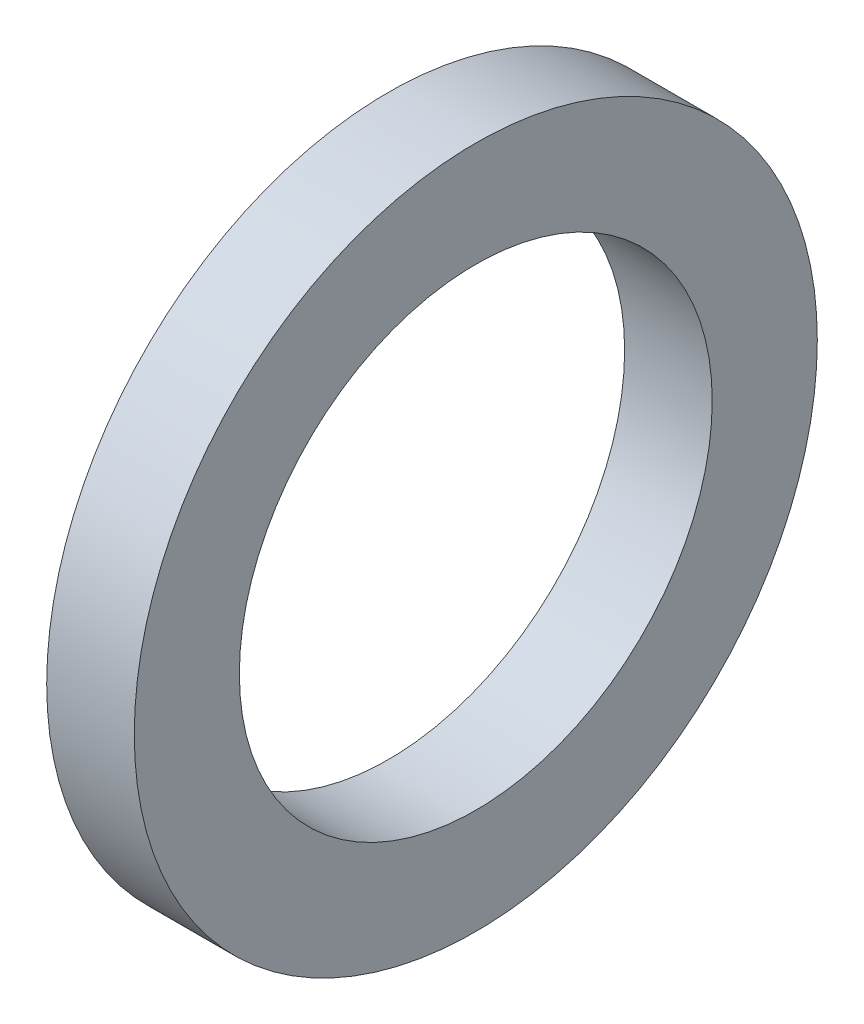
ISO-10303-21;
HEADER;
FILE_DESCRIPTION(('STEP AP214'),'2;1');
FILE_NAME('part.step','',(''),(''),'','','');
FILE_SCHEMA(('AUTOMOTIVE_DESIGN { 1 0 10303 214 1 1 1 1 }'));
ENDSEC;
DATA;
#1=APPLICATION_CONTEXT('core data for automotive mechanical design processes');
#2=APPLICATION_PROTOCOL_DEFINITION('international standard','automotive_design',2000,#1);
#3=PRODUCT_CONTEXT('',#1,'mechanical');
#4=PRODUCT('Part','Part','',(#3));
#5=PRODUCT_RELATED_PRODUCT_CATEGORY('part','',(#4));
#6=PRODUCT_DEFINITION_FORMATION('','',#4);
#7=PRODUCT_DEFINITION_CONTEXT('part definition',#1,'design');
#8=PRODUCT_DEFINITION('design','',#6,#7);
#9=PRODUCT_DEFINITION_SHAPE('','',#8);
#10=(LENGTH_UNIT() NAMED_UNIT(*) SI_UNIT(.MILLI.,.METRE.));
#11=(NAMED_UNIT(*) PLANE_ANGLE_UNIT() SI_UNIT($,.RADIAN.));
#12=(NAMED_UNIT(*) SI_UNIT($,.STERADIAN.) SOLID_ANGLE_UNIT());
#13=UNCERTAINTY_MEASURE_WITH_UNIT(LENGTH_MEASURE(1.E-05),#10,'distance_accuracy_value','');
#14=(GEOMETRIC_REPRESENTATION_CONTEXT(3) GLOBAL_UNCERTAINTY_ASSIGNED_CONTEXT((#13)) GLOBAL_UNIT_ASSIGNED_CONTEXT((#10,
#11,#12)) REPRESENTATION_CONTEXT('',''));
#15=CARTESIAN_POINT('',(0.,0.,0.));
#16=DIRECTION('',(0.,0.,1.));
#17=DIRECTION('',(1.,0.,0.));
#18=AXIS2_PLACEMENT_3D('',#15,#16,#17);
#19=CARTESIAN_POINT('',(-34.9249999999999,0.,0.));
#20=DIRECTION('',(-1.,0.,0.));
#21=DIRECTION('',(0.,0.,1.));
#22=AXIS2_PLACEMENT_3D('',#19,#20,#21);
#23=CYLINDRICAL_SURFACE('',#22,13.5);
#24=CARTESIAN_POINT('',(0.,0.,0.));
#25=DIRECTION('',(-1.,0.,0.));
#26=DIRECTION('',(0.,0.,1.));
#27=AXIS2_PLACEMENT_3D('',#24,#25,#26);
#28=CIRCLE('',#27,13.5);
#29=CARTESIAN_POINT('',(0.,0.,13.5));
#30=VERTEX_POINT('',#29);
#31=EDGE_CURVE('E10',#30,#30,#28,.T.);
#32=ORIENTED_EDGE('',*,*,#31,.F.);
#33=EDGE_LOOP('',(#32));
#34=FACE_BOUND('',#33,.T.);
#35=CARTESIAN_POINT('',(-5.,0.,0.));
#36=DIRECTION('',(-1.,0.,0.));
#37=DIRECTION('',(0.,0.,1.));
#38=AXIS2_PLACEMENT_3D('',#35,#36,#37);
#39=CIRCLE('',#38,13.5);
#40=CARTESIAN_POINT('',(-5.,0.,13.5));
#41=VERTEX_POINT('',#40);
#42=EDGE_CURVE('E51',#41,#41,#39,.T.);
#43=ORIENTED_EDGE('',*,*,#42,.T.);
#44=EDGE_LOOP('',(#43));
#45=FACE_BOUND('',#44,.T.);
#46=ADVANCED_FACE('F40',(#34,#45),#23,.F.);
#47=CARTESIAN_POINT('',(0.,13.5,0.));
#48=DIRECTION('',(-1.,0.,0.));
#49=DIRECTION('',(0.,0.,1.));
#50=AXIS2_PLACEMENT_3D('',#47,#48,#49);
#51=PLANE('',#50);
#52=CARTESIAN_POINT('',(0.,0.,0.));
#53=DIRECTION('',(-1.,0.,0.));
#54=DIRECTION('',(0.,0.,1.));
#55=AXIS2_PLACEMENT_3D('',#52,#53,#54);
#56=CIRCLE('',#55,19.5);
#57=CARTESIAN_POINT('',(0.,0.,19.5));
#58=VERTEX_POINT('',#57);
#59=EDGE_CURVE('E43',#58,#58,#56,.T.);
#60=ORIENTED_EDGE('',*,*,#59,.F.);
#61=EDGE_LOOP('',(#60));
#62=FACE_BOUND('',#61,.T.);
#63=ORIENTED_EDGE('',*,*,#31,.T.);
#64=EDGE_LOOP('',(#63));
#65=FACE_BOUND('',#64,.T.);
#66=ADVANCED_FACE('F66',(#62,#65),#51,.F.);
#67=CARTESIAN_POINT('',(-34.9249999999999,0.,0.));
#68=DIRECTION('',(-1.,0.,0.));
#69=DIRECTION('',(0.,0.,1.));
#70=AXIS2_PLACEMENT_3D('',#67,#68,#69);
#71=CYLINDRICAL_SURFACE('',#70,19.5);
#72=CARTESIAN_POINT('',(-5.,0.,0.));
#73=DIRECTION('',(-1.,0.,0.));
#74=DIRECTION('',(0.,0.,1.));
#75=AXIS2_PLACEMENT_3D('',#72,#73,#74);
#76=CIRCLE('',#75,19.5);
#77=CARTESIAN_POINT('',(-5.,0.,19.5));
#78=VERTEX_POINT('',#77);
#79=EDGE_CURVE('E50',#78,#78,#76,.T.);
#80=ORIENTED_EDGE('',*,*,#79,.F.);
#81=EDGE_LOOP('',(#80));
#82=FACE_BOUND('',#81,.T.);
#83=ORIENTED_EDGE('',*,*,#59,.T.);
#84=EDGE_LOOP('',(#83));
#85=FACE_BOUND('',#84,.T.);
#86=ADVANCED_FACE('F62',(#82,#85),#71,.T.);
#87=CARTESIAN_POINT('',(-5.,19.5,0.));
#88=DIRECTION('',(1.,0.,0.));
#89=DIRECTION('',(0.,0.,-1.));
#90=AXIS2_PLACEMENT_3D('',#87,#88,#89);
#91=PLANE('',#90);
#92=ORIENTED_EDGE('',*,*,#42,.F.);
#93=EDGE_LOOP('',(#92));
#94=FACE_BOUND('',#93,.T.);
#95=ORIENTED_EDGE('',*,*,#79,.T.);
#96=EDGE_LOOP('',(#95));
#97=FACE_BOUND('',#96,.T.);
#98=ADVANCED_FACE('F59',(#94,#97),#91,.F.);
#99=CLOSED_SHELL('',(#46,#66,#86,#98));
#100=MANIFOLD_SOLID_BREP('B2',#99);
#101=ADVANCED_BREP_SHAPE_REPRESENTATION('',(#18,#100),#14);
#102=SHAPE_DEFINITION_REPRESENTATION(#9,#101);
ENDSEC;
END-ISO-10303-21;
